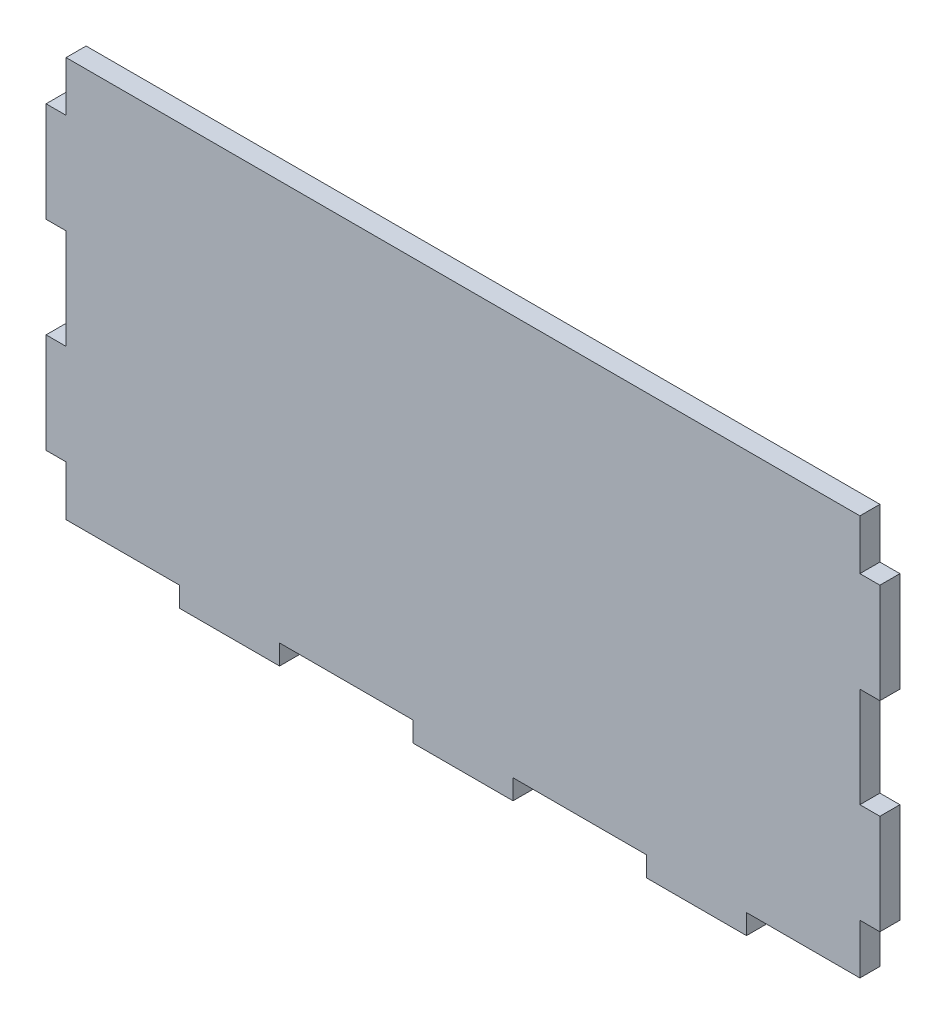
ISO-10303-21;
HEADER;
FILE_DESCRIPTION(('STEP AP214'),'2;1');
FILE_NAME('part.step','',(''),(''),'','','');
FILE_SCHEMA(('AUTOMOTIVE_DESIGN { 1 0 10303 214 1 1 1 1 }'));
ENDSEC;
DATA;
#1=APPLICATION_CONTEXT('core data for automotive mechanical design processes');
#2=APPLICATION_PROTOCOL_DEFINITION('international standard','automotive_design',2000,#1);
#3=PRODUCT_CONTEXT('',#1,'mechanical');
#4=PRODUCT('Part','Part','',(#3));
#5=PRODUCT_RELATED_PRODUCT_CATEGORY('part','',(#4));
#6=PRODUCT_DEFINITION_FORMATION('','',#4);
#7=PRODUCT_DEFINITION_CONTEXT('part definition',#1,'design');
#8=PRODUCT_DEFINITION('design','',#6,#7);
#9=PRODUCT_DEFINITION_SHAPE('','',#8);
#10=(LENGTH_UNIT() NAMED_UNIT(*) SI_UNIT(.MILLI.,.METRE.));
#11=(NAMED_UNIT(*) PLANE_ANGLE_UNIT() SI_UNIT($,.RADIAN.));
#12=(NAMED_UNIT(*) SI_UNIT($,.STERADIAN.) SOLID_ANGLE_UNIT());
#13=UNCERTAINTY_MEASURE_WITH_UNIT(LENGTH_MEASURE(1.E-05),#10,'distance_accuracy_value','');
#14=(GEOMETRIC_REPRESENTATION_CONTEXT(3) GLOBAL_UNCERTAINTY_ASSIGNED_CONTEXT((#13)) GLOBAL_UNIT_ASSIGNED_CONTEXT((#10,
#11,#12)) REPRESENTATION_CONTEXT('',''));
#15=CARTESIAN_POINT('',(0.,0.,0.));
#16=DIRECTION('',(0.,0.,1.));
#17=DIRECTION('',(1.,0.,0.));
#18=AXIS2_PLACEMENT_3D('',#15,#16,#17);
#19=CARTESIAN_POINT('',(0.,0.,6.));
#20=DIRECTION('',(-1.,0.,0.));
#21=DIRECTION('',(0.,0.,1.));
#22=AXIS2_PLACEMENT_3D('',#19,#20,#21);
#23=PLANE('',#22);
#24=DIRECTION('',(0.,1.,0.));
#25=VECTOR('',#24,1.);
#26=CARTESIAN_POINT('',(0.,0.,0.));
#27=LINE('',#26,#25);
#28=CARTESIAN_POINT('',(0.,-15.,0.));
#29=VERTEX_POINT('',#28);
#30=CARTESIAN_POINT('',(0.,0.,0.));
#31=VERTEX_POINT('',#30);
#32=EDGE_CURVE('E288',#29,#31,#27,.T.);
#33=ORIENTED_EDGE('',*,*,#32,.T.);
#34=DIRECTION('',(0.,0.,-1.));
#35=VECTOR('',#34,1.);
#36=CARTESIAN_POINT('',(0.,0.,6.));
#37=LINE('',#36,#35);
#38=CARTESIAN_POINT('',(0.,0.,6.));
#39=VERTEX_POINT('',#38);
#40=EDGE_CURVE('E11',#39,#31,#37,.T.);
#41=ORIENTED_EDGE('',*,*,#40,.F.);
#42=DIRECTION('',(0.,1.,0.));
#43=VECTOR('',#42,1.);
#44=CARTESIAN_POINT('',(0.,0.,6.));
#45=LINE('',#44,#43);
#46=CARTESIAN_POINT('',(0.,-15.,6.));
#47=VERTEX_POINT('',#46);
#48=EDGE_CURVE('E382',#47,#39,#45,.T.);
#49=ORIENTED_EDGE('',*,*,#48,.F.);
#50=DIRECTION('',(0.,0.,-1.));
#51=VECTOR('',#50,1.);
#52=CARTESIAN_POINT('',(0.,-15.,6.));
#53=LINE('',#52,#51);
#54=EDGE_CURVE('E284',#47,#29,#53,.T.);
#55=ORIENTED_EDGE('',*,*,#54,.T.);
#56=EDGE_LOOP('',(#33,#41,#49,#55));
#57=FACE_BOUND('',#56,.T.);
#58=ADVANCED_FACE('F43',(#57),#23,.F.);
#59=CARTESIAN_POINT('',(0.,0.,6.));
#60=DIRECTION('',(0.,-1.,0.));
#61=DIRECTION('',(0.,0.,-1.));
#62=AXIS2_PLACEMENT_3D('',#59,#60,#61);
#63=PLANE('',#62);
#64=DIRECTION('',(-1.,0.,0.));
#65=VECTOR('',#64,1.);
#66=CARTESIAN_POINT('',(0.,0.,0.));
#67=LINE('',#66,#65);
#68=CARTESIAN_POINT('',(-238.,0.,0.));
#69=VERTEX_POINT('',#68);
#70=EDGE_CURVE('E292',#31,#69,#67,.T.);
#71=ORIENTED_EDGE('',*,*,#70,.T.);
#72=DIRECTION('',(0.,0.,-1.));
#73=VECTOR('',#72,1.);
#74=CARTESIAN_POINT('',(-238.,0.,6.));
#75=LINE('',#74,#73);
#76=CARTESIAN_POINT('',(-238.,0.,6.));
#77=VERTEX_POINT('',#76);
#78=EDGE_CURVE('E52',#77,#69,#75,.T.);
#79=ORIENTED_EDGE('',*,*,#78,.F.);
#80=DIRECTION('',(-1.,0.,0.));
#81=VECTOR('',#80,1.);
#82=CARTESIAN_POINT('',(0.,0.,6.));
#83=LINE('',#82,#81);
#84=EDGE_CURVE('E175',#39,#77,#83,.T.);
#85=ORIENTED_EDGE('',*,*,#84,.F.);
#86=ORIENTED_EDGE('',*,*,#40,.T.);
#87=EDGE_LOOP('',(#71,#79,#85,#86));
#88=FACE_BOUND('',#87,.T.);
#89=ADVANCED_FACE('F616',(#88),#63,.F.);
#90=CARTESIAN_POINT('',(-238.,0.,6.));
#91=DIRECTION('',(1.,0.,0.));
#92=DIRECTION('',(0.,0.,-1.));
#93=AXIS2_PLACEMENT_3D('',#90,#91,#92);
#94=PLANE('',#93);
#95=DIRECTION('',(0.,-1.,0.));
#96=VECTOR('',#95,1.);
#97=CARTESIAN_POINT('',(-238.,0.,0.));
#98=LINE('',#97,#96);
#99=CARTESIAN_POINT('',(-238.,-15.,0.));
#100=VERTEX_POINT('',#99);
#101=EDGE_CURVE('E295',#69,#100,#98,.T.);
#102=ORIENTED_EDGE('',*,*,#101,.T.);
#103=DIRECTION('',(0.,0.,-1.));
#104=VECTOR('',#103,1.);
#105=CARTESIAN_POINT('',(-238.,-15.,6.));
#106=LINE('',#105,#104);
#107=CARTESIAN_POINT('',(-238.,-15.,6.));
#108=VERTEX_POINT('',#107);
#109=EDGE_CURVE('E489',#108,#100,#106,.T.);
#110=ORIENTED_EDGE('',*,*,#109,.F.);
#111=DIRECTION('',(0.,-1.,0.));
#112=VECTOR('',#111,1.);
#113=CARTESIAN_POINT('',(-238.,0.,6.));
#114=LINE('',#113,#112);
#115=EDGE_CURVE('E499',#77,#108,#114,.T.);
#116=ORIENTED_EDGE('',*,*,#115,.F.);
#117=ORIENTED_EDGE('',*,*,#78,.T.);
#118=EDGE_LOOP('',(#102,#110,#116,#117));
#119=FACE_BOUND('',#118,.T.);
#120=ADVANCED_FACE('F497',(#119),#94,.F.);
#121=CARTESIAN_POINT('',(-238.,-15.,6.));
#122=DIRECTION('',(0.,-1.,0.));
#123=DIRECTION('',(0.,0.,-1.));
#124=AXIS2_PLACEMENT_3D('',#121,#122,#123);
#125=PLANE('',#124);
#126=DIRECTION('',(-1.,0.,0.));
#127=VECTOR('',#126,1.);
#128=CARTESIAN_POINT('',(-238.,-15.,0.));
#129=LINE('',#128,#127);
#130=CARTESIAN_POINT('',(-244.,-15.,0.));
#131=VERTEX_POINT('',#130);
#132=EDGE_CURVE('E298',#100,#131,#129,.T.);
#133=ORIENTED_EDGE('',*,*,#132,.T.);
#134=DIRECTION('',(0.,0.,-1.));
#135=VECTOR('',#134,1.);
#136=CARTESIAN_POINT('',(-244.,-15.,6.));
#137=LINE('',#136,#135);
#138=CARTESIAN_POINT('',(-244.,-15.,6.));
#139=VERTEX_POINT('',#138);
#140=EDGE_CURVE('E485',#139,#131,#137,.T.);
#141=ORIENTED_EDGE('',*,*,#140,.F.);
#142=DIRECTION('',(-1.,0.,0.));
#143=VECTOR('',#142,1.);
#144=CARTESIAN_POINT('',(-238.,-15.,6.));
#145=LINE('',#144,#143);
#146=EDGE_CURVE('E518',#108,#139,#145,.T.);
#147=ORIENTED_EDGE('',*,*,#146,.F.);
#148=ORIENTED_EDGE('',*,*,#109,.T.);
#149=EDGE_LOOP('',(#133,#141,#147,#148));
#150=FACE_BOUND('',#149,.T.);
#151=ADVANCED_FACE('F508',(#150),#125,.F.);
#152=CARTESIAN_POINT('',(-244.,-45.,6.));
#153=DIRECTION('',(1.,0.,0.));
#154=DIRECTION('',(0.,0.,-1.));
#155=AXIS2_PLACEMENT_3D('',#152,#153,#154);
#156=PLANE('',#155);
#157=DIRECTION('',(0.,-1.,0.));
#158=VECTOR('',#157,1.);
#159=CARTESIAN_POINT('',(-244.,-45.,0.));
#160=LINE('',#159,#158);
#161=CARTESIAN_POINT('',(-244.,-45.,0.));
#162=VERTEX_POINT('',#161);
#163=EDGE_CURVE('E301',#131,#162,#160,.T.);
#164=ORIENTED_EDGE('',*,*,#163,.T.);
#165=DIRECTION('',(0.,0.,-1.));
#166=VECTOR('',#165,1.);
#167=CARTESIAN_POINT('',(-244.,-45.,6.));
#168=LINE('',#167,#166);
#169=CARTESIAN_POINT('',(-244.,-45.,6.));
#170=VERTEX_POINT('',#169);
#171=EDGE_CURVE('E481',#170,#162,#168,.T.);
#172=ORIENTED_EDGE('',*,*,#171,.F.);
#173=DIRECTION('',(0.,-1.,0.));
#174=VECTOR('',#173,1.);
#175=CARTESIAN_POINT('',(-244.,-45.,6.));
#176=LINE('',#175,#174);
#177=EDGE_CURVE('E514',#139,#170,#176,.T.);
#178=ORIENTED_EDGE('',*,*,#177,.F.);
#179=ORIENTED_EDGE('',*,*,#140,.T.);
#180=EDGE_LOOP('',(#164,#172,#178,#179));
#181=FACE_BOUND('',#180,.T.);
#182=ADVANCED_FACE('F512',(#181),#156,.F.);
#183=CARTESIAN_POINT('',(-238.,-45.,6.));
#184=DIRECTION('',(0.,1.,0.));
#185=DIRECTION('',(0.,0.,1.));
#186=AXIS2_PLACEMENT_3D('',#183,#184,#185);
#187=PLANE('',#186);
#188=DIRECTION('',(1.,0.,0.));
#189=VECTOR('',#188,1.);
#190=CARTESIAN_POINT('',(-238.,-45.,0.));
#191=LINE('',#190,#189);
#192=CARTESIAN_POINT('',(-238.,-45.,0.));
#193=VERTEX_POINT('',#192);
#194=EDGE_CURVE('E304',#162,#193,#191,.T.);
#195=ORIENTED_EDGE('',*,*,#194,.T.);
#196=DIRECTION('',(0.,0.,-1.));
#197=VECTOR('',#196,1.);
#198=CARTESIAN_POINT('',(-238.,-45.,6.));
#199=LINE('',#198,#197);
#200=CARTESIAN_POINT('',(-238.,-45.,6.));
#201=VERTEX_POINT('',#200);
#202=EDGE_CURVE('E477',#201,#193,#199,.T.);
#203=ORIENTED_EDGE('',*,*,#202,.F.);
#204=DIRECTION('',(1.,0.,0.));
#205=VECTOR('',#204,1.);
#206=CARTESIAN_POINT('',(-238.,-45.,6.));
#207=LINE('',#206,#205);
#208=EDGE_CURVE('E517',#170,#201,#207,.T.);
#209=ORIENTED_EDGE('',*,*,#208,.F.);
#210=ORIENTED_EDGE('',*,*,#171,.T.);
#211=EDGE_LOOP('',(#195,#203,#209,#210));
#212=FACE_BOUND('',#211,.T.);
#213=ADVANCED_FACE('F629',(#212),#187,.F.);
#214=CARTESIAN_POINT('',(-238.,-45.,6.));
#215=DIRECTION('',(1.,0.,0.));
#216=DIRECTION('',(0.,0.,-1.));
#217=AXIS2_PLACEMENT_3D('',#214,#215,#216);
#218=PLANE('',#217);
#219=DIRECTION('',(0.,-1.,0.));
#220=VECTOR('',#219,1.);
#221=CARTESIAN_POINT('',(-238.,-45.,0.));
#222=LINE('',#221,#220);
#223=CARTESIAN_POINT('',(-238.,-75.,0.));
#224=VERTEX_POINT('',#223);
#225=EDGE_CURVE('E307',#193,#224,#222,.T.);
#226=ORIENTED_EDGE('',*,*,#225,.T.);
#227=DIRECTION('',(0.,0.,-1.));
#228=VECTOR('',#227,1.);
#229=CARTESIAN_POINT('',(-238.,-75.,6.));
#230=LINE('',#229,#228);
#231=CARTESIAN_POINT('',(-238.,-75.,6.));
#232=VERTEX_POINT('',#231);
#233=EDGE_CURVE('E473',#232,#224,#230,.T.);
#234=ORIENTED_EDGE('',*,*,#233,.F.);
#235=DIRECTION('',(0.,-1.,0.));
#236=VECTOR('',#235,1.);
#237=CARTESIAN_POINT('',(-238.,-45.,6.));
#238=LINE('',#237,#236);
#239=EDGE_CURVE('E522',#201,#232,#238,.T.);
#240=ORIENTED_EDGE('',*,*,#239,.F.);
#241=ORIENTED_EDGE('',*,*,#202,.T.);
#242=EDGE_LOOP('',(#226,#234,#240,#241));
#243=FACE_BOUND('',#242,.T.);
#244=ADVANCED_FACE('F632',(#243),#218,.F.);
#245=CARTESIAN_POINT('',(-238.,-75.,6.));
#246=DIRECTION('',(0.,-1.,0.));
#247=DIRECTION('',(1.,0.,0.));
#248=AXIS2_PLACEMENT_3D('',#245,#246,#247);
#249=PLANE('',#248);
#250=DIRECTION('',(-1.,0.,0.));
#251=VECTOR('',#250,1.);
#252=CARTESIAN_POINT('',(-238.,-75.,0.));
#253=LINE('',#252,#251);
#254=CARTESIAN_POINT('',(-244.,-75.,0.));
#255=VERTEX_POINT('',#254);
#256=EDGE_CURVE('E310',#224,#255,#253,.T.);
#257=ORIENTED_EDGE('',*,*,#256,.T.);
#258=DIRECTION('',(0.,0.,-1.));
#259=VECTOR('',#258,1.);
#260=CARTESIAN_POINT('',(-244.,-75.,6.));
#261=LINE('',#260,#259);
#262=CARTESIAN_POINT('',(-244.,-75.,6.));
#263=VERTEX_POINT('',#262);
#264=EDGE_CURVE('E469',#263,#255,#261,.T.);
#265=ORIENTED_EDGE('',*,*,#264,.F.);
#266=DIRECTION('',(-1.,0.,0.));
#267=VECTOR('',#266,1.);
#268=CARTESIAN_POINT('',(-238.,-75.,6.));
#269=LINE('',#268,#267);
#270=EDGE_CURVE('E529',#232,#263,#269,.T.);
#271=ORIENTED_EDGE('',*,*,#270,.F.);
#272=ORIENTED_EDGE('',*,*,#233,.T.);
#273=EDGE_LOOP('',(#257,#265,#271,#272));
#274=FACE_BOUND('',#273,.T.);
#275=ADVANCED_FACE('F636',(#274),#249,.F.);
#276=CARTESIAN_POINT('',(-244.,-105.,6.));
#277=DIRECTION('',(1.,0.,0.));
#278=DIRECTION('',(0.,0.,-1.));
#279=AXIS2_PLACEMENT_3D('',#276,#277,#278);
#280=PLANE('',#279);
#281=DIRECTION('',(0.,-1.,0.));
#282=VECTOR('',#281,1.);
#283=CARTESIAN_POINT('',(-244.,-105.,0.));
#284=LINE('',#283,#282);
#285=CARTESIAN_POINT('',(-244.,-105.,0.));
#286=VERTEX_POINT('',#285);
#287=EDGE_CURVE('E313',#255,#286,#284,.T.);
#288=ORIENTED_EDGE('',*,*,#287,.T.);
#289=DIRECTION('',(0.,0.,-1.));
#290=VECTOR('',#289,1.);
#291=CARTESIAN_POINT('',(-244.,-105.,6.));
#292=LINE('',#291,#290);
#293=CARTESIAN_POINT('',(-244.,-105.,6.));
#294=VERTEX_POINT('',#293);
#295=EDGE_CURVE('E465',#294,#286,#292,.T.);
#296=ORIENTED_EDGE('',*,*,#295,.F.);
#297=DIRECTION('',(0.,-1.,0.));
#298=VECTOR('',#297,1.);
#299=CARTESIAN_POINT('',(-244.,-105.,6.));
#300=LINE('',#299,#298);
#301=EDGE_CURVE('E532',#263,#294,#300,.T.);
#302=ORIENTED_EDGE('',*,*,#301,.F.);
#303=ORIENTED_EDGE('',*,*,#264,.T.);
#304=EDGE_LOOP('',(#288,#296,#302,#303));
#305=FACE_BOUND('',#304,.T.);
#306=ADVANCED_FACE('F640',(#305),#280,.F.);
#307=CARTESIAN_POINT('',(-238.,-105.,6.));
#308=DIRECTION('',(0.,1.,0.));
#309=DIRECTION('',(0.,0.,1.));
#310=AXIS2_PLACEMENT_3D('',#307,#308,#309);
#311=PLANE('',#310);
#312=DIRECTION('',(1.,0.,0.));
#313=VECTOR('',#312,1.);
#314=CARTESIAN_POINT('',(-238.,-105.,0.));
#315=LINE('',#314,#313);
#316=CARTESIAN_POINT('',(-238.,-105.,0.));
#317=VERTEX_POINT('',#316);
#318=EDGE_CURVE('E316',#286,#317,#315,.T.);
#319=ORIENTED_EDGE('',*,*,#318,.T.);
#320=DIRECTION('',(0.,0.,-1.));
#321=VECTOR('',#320,1.);
#322=CARTESIAN_POINT('',(-238.,-105.,6.));
#323=LINE('',#322,#321);
#324=CARTESIAN_POINT('',(-238.,-105.,6.));
#325=VERTEX_POINT('',#324);
#326=EDGE_CURVE('E461',#325,#317,#323,.T.);
#327=ORIENTED_EDGE('',*,*,#326,.F.);
#328=DIRECTION('',(1.,0.,0.));
#329=VECTOR('',#328,1.);
#330=CARTESIAN_POINT('',(-238.,-105.,6.));
#331=LINE('',#330,#329);
#332=EDGE_CURVE('E535',#294,#325,#331,.T.);
#333=ORIENTED_EDGE('',*,*,#332,.F.);
#334=ORIENTED_EDGE('',*,*,#295,.T.);
#335=EDGE_LOOP('',(#319,#327,#333,#334));
#336=FACE_BOUND('',#335,.T.);
#337=ADVANCED_FACE('F644',(#336),#311,.F.);
#338=CARTESIAN_POINT('',(-238.,-105.,6.));
#339=DIRECTION('',(1.,0.,0.));
#340=DIRECTION('',(0.,1.,0.));
#341=AXIS2_PLACEMENT_3D('',#338,#339,#340);
#342=PLANE('',#341);
#343=DIRECTION('',(0.,-1.,0.));
#344=VECTOR('',#343,1.);
#345=CARTESIAN_POINT('',(-238.,-105.,0.));
#346=LINE('',#345,#344);
#347=CARTESIAN_POINT('',(-238.,-120.,0.));
#348=VERTEX_POINT('',#347);
#349=EDGE_CURVE('E319',#317,#348,#346,.T.);
#350=ORIENTED_EDGE('',*,*,#349,.T.);
#351=DIRECTION('',(0.,0.,-1.));
#352=VECTOR('',#351,1.);
#353=CARTESIAN_POINT('',(-238.,-120.,6.));
#354=LINE('',#353,#352);
#355=CARTESIAN_POINT('',(-238.,-120.,6.));
#356=VERTEX_POINT('',#355);
#357=EDGE_CURVE('E457',#356,#348,#354,.T.);
#358=ORIENTED_EDGE('',*,*,#357,.F.);
#359=DIRECTION('',(0.,-1.,0.));
#360=VECTOR('',#359,1.);
#361=CARTESIAN_POINT('',(-238.,-105.,6.));
#362=LINE('',#361,#360);
#363=EDGE_CURVE('E538',#325,#356,#362,.T.);
#364=ORIENTED_EDGE('',*,*,#363,.F.);
#365=ORIENTED_EDGE('',*,*,#326,.T.);
#366=EDGE_LOOP('',(#350,#358,#364,#365));
#367=FACE_BOUND('',#366,.T.);
#368=ADVANCED_FACE('F648',(#367),#342,.F.);
#369=CARTESIAN_POINT('',(-204.,-120.,6.));
#370=DIRECTION('',(0.,1.,0.));
#371=DIRECTION('',(-1.,0.,0.));
#372=AXIS2_PLACEMENT_3D('',#369,#370,#371);
#373=PLANE('',#372);
#374=DIRECTION('',(1.,0.,0.));
#375=VECTOR('',#374,1.);
#376=CARTESIAN_POINT('',(-204.,-120.,0.));
#377=LINE('',#376,#375);
#378=CARTESIAN_POINT('',(-204.,-120.,0.));
#379=VERTEX_POINT('',#378);
#380=EDGE_CURVE('E322',#348,#379,#377,.T.);
#381=ORIENTED_EDGE('',*,*,#380,.T.);
#382=DIRECTION('',(0.,0.,-1.));
#383=VECTOR('',#382,1.);
#384=CARTESIAN_POINT('',(-204.,-120.,6.));
#385=LINE('',#384,#383);
#386=CARTESIAN_POINT('',(-204.,-120.,6.));
#387=VERTEX_POINT('',#386);
#388=EDGE_CURVE('E453',#387,#379,#385,.T.);
#389=ORIENTED_EDGE('',*,*,#388,.F.);
#390=DIRECTION('',(1.,0.,0.));
#391=VECTOR('',#390,1.);
#392=CARTESIAN_POINT('',(-204.,-120.,6.));
#393=LINE('',#392,#391);
#394=EDGE_CURVE('E541',#356,#387,#393,.T.);
#395=ORIENTED_EDGE('',*,*,#394,.F.);
#396=ORIENTED_EDGE('',*,*,#357,.T.);
#397=EDGE_LOOP('',(#381,#389,#395,#396));
#398=FACE_BOUND('',#397,.T.);
#399=ADVANCED_FACE('F652',(#398),#373,.F.);
#400=CARTESIAN_POINT('',(-204.,-120.,6.));
#401=DIRECTION('',(1.,0.,0.));
#402=DIRECTION('',(0.,0.,-1.));
#403=AXIS2_PLACEMENT_3D('',#400,#401,#402);
#404=PLANE('',#403);
#405=DIRECTION('',(0.,-1.,0.));
#406=VECTOR('',#405,1.);
#407=CARTESIAN_POINT('',(-204.,-120.,0.));
#408=LINE('',#407,#406);
#409=CARTESIAN_POINT('',(-204.,-126.,0.));
#410=VERTEX_POINT('',#409);
#411=EDGE_CURVE('E325',#379,#410,#408,.T.);
#412=ORIENTED_EDGE('',*,*,#411,.T.);
#413=DIRECTION('',(0.,0.,-1.));
#414=VECTOR('',#413,1.);
#415=CARTESIAN_POINT('',(-204.,-126.,6.));
#416=LINE('',#415,#414);
#417=CARTESIAN_POINT('',(-204.,-126.,6.));
#418=VERTEX_POINT('',#417);
#419=EDGE_CURVE('E449',#418,#410,#416,.T.);
#420=ORIENTED_EDGE('',*,*,#419,.F.);
#421=DIRECTION('',(0.,-1.,0.));
#422=VECTOR('',#421,1.);
#423=CARTESIAN_POINT('',(-204.,-120.,6.));
#424=LINE('',#423,#422);
#425=EDGE_CURVE('E544',#387,#418,#424,.T.);
#426=ORIENTED_EDGE('',*,*,#425,.F.);
#427=ORIENTED_EDGE('',*,*,#388,.T.);
#428=EDGE_LOOP('',(#412,#420,#426,#427));
#429=FACE_BOUND('',#428,.T.);
#430=ADVANCED_FACE('F656',(#429),#404,.F.);
#431=CARTESIAN_POINT('',(-204.,-126.,6.));
#432=DIRECTION('',(0.,1.,0.));
#433=DIRECTION('',(0.,0.,1.));
#434=AXIS2_PLACEMENT_3D('',#431,#432,#433);
#435=PLANE('',#434);
#436=DIRECTION('',(1.,0.,0.));
#437=VECTOR('',#436,1.);
#438=CARTESIAN_POINT('',(-204.,-126.,0.));
#439=LINE('',#438,#437);
#440=CARTESIAN_POINT('',(-174.,-126.,0.));
#441=VERTEX_POINT('',#440);
#442=EDGE_CURVE('E328',#410,#441,#439,.T.);
#443=ORIENTED_EDGE('',*,*,#442,.T.);
#444=DIRECTION('',(0.,0.,-1.));
#445=VECTOR('',#444,1.);
#446=CARTESIAN_POINT('',(-174.,-126.,6.));
#447=LINE('',#446,#445);
#448=CARTESIAN_POINT('',(-174.,-126.,6.));
#449=VERTEX_POINT('',#448);
#450=EDGE_CURVE('E445',#449,#441,#447,.T.);
#451=ORIENTED_EDGE('',*,*,#450,.F.);
#452=DIRECTION('',(1.,0.,0.));
#453=VECTOR('',#452,1.);
#454=CARTESIAN_POINT('',(-204.,-126.,6.));
#455=LINE('',#454,#453);
#456=EDGE_CURVE('E547',#418,#449,#455,.T.);
#457=ORIENTED_EDGE('',*,*,#456,.F.);
#458=ORIENTED_EDGE('',*,*,#419,.T.);
#459=EDGE_LOOP('',(#443,#451,#457,#458));
#460=FACE_BOUND('',#459,.T.);
#461=ADVANCED_FACE('F660',(#460),#435,.F.);
#462=CARTESIAN_POINT('',(-174.,-120.,6.));
#463=DIRECTION('',(-1.,0.,0.));
#464=DIRECTION('',(0.,0.,1.));
#465=AXIS2_PLACEMENT_3D('',#462,#463,#464);
#466=PLANE('',#465);
#467=DIRECTION('',(0.,1.,0.));
#468=VECTOR('',#467,1.);
#469=CARTESIAN_POINT('',(-174.,-120.,0.));
#470=LINE('',#469,#468);
#471=CARTESIAN_POINT('',(-174.,-120.,0.));
#472=VERTEX_POINT('',#471);
#473=EDGE_CURVE('E331',#441,#472,#470,.T.);
#474=ORIENTED_EDGE('',*,*,#473,.T.);
#475=DIRECTION('',(0.,0.,-1.));
#476=VECTOR('',#475,1.);
#477=CARTESIAN_POINT('',(-174.,-120.,6.));
#478=LINE('',#477,#476);
#479=CARTESIAN_POINT('',(-174.,-120.,6.));
#480=VERTEX_POINT('',#479);
#481=EDGE_CURVE('E441',#480,#472,#478,.T.);
#482=ORIENTED_EDGE('',*,*,#481,.F.);
#483=DIRECTION('',(0.,1.,0.));
#484=VECTOR('',#483,1.);
#485=CARTESIAN_POINT('',(-174.,-120.,6.));
#486=LINE('',#485,#484);
#487=EDGE_CURVE('E550',#449,#480,#486,.T.);
#488=ORIENTED_EDGE('',*,*,#487,.F.);
#489=ORIENTED_EDGE('',*,*,#450,.T.);
#490=EDGE_LOOP('',(#474,#482,#488,#489));
#491=FACE_BOUND('',#490,.T.);
#492=ADVANCED_FACE('F664',(#491),#466,.F.);
#493=CARTESIAN_POINT('',(-134.,-120.,6.));
#494=DIRECTION('',(0.,1.,0.));
#495=DIRECTION('',(-1.,0.,0.));
#496=AXIS2_PLACEMENT_3D('',#493,#494,#495);
#497=PLANE('',#496);
#498=DIRECTION('',(1.,0.,0.));
#499=VECTOR('',#498,1.);
#500=CARTESIAN_POINT('',(-134.,-120.,0.));
#501=LINE('',#500,#499);
#502=CARTESIAN_POINT('',(-134.,-120.,0.));
#503=VERTEX_POINT('',#502);
#504=EDGE_CURVE('E334',#472,#503,#501,.T.);
#505=ORIENTED_EDGE('',*,*,#504,.T.);
#506=DIRECTION('',(0.,0.,-1.));
#507=VECTOR('',#506,1.);
#508=CARTESIAN_POINT('',(-134.,-120.,6.));
#509=LINE('',#508,#507);
#510=CARTESIAN_POINT('',(-134.,-120.,6.));
#511=VERTEX_POINT('',#510);
#512=EDGE_CURVE('E437',#511,#503,#509,.T.);
#513=ORIENTED_EDGE('',*,*,#512,.F.);
#514=DIRECTION('',(1.,0.,0.));
#515=VECTOR('',#514,1.);
#516=CARTESIAN_POINT('',(-134.,-120.,6.));
#517=LINE('',#516,#515);
#518=EDGE_CURVE('E553',#480,#511,#517,.T.);
#519=ORIENTED_EDGE('',*,*,#518,.F.);
#520=ORIENTED_EDGE('',*,*,#481,.T.);
#521=EDGE_LOOP('',(#505,#513,#519,#520));
#522=FACE_BOUND('',#521,.T.);
#523=ADVANCED_FACE('F668',(#522),#497,.F.);
#524=CARTESIAN_POINT('',(-134.,-120.,6.));
#525=DIRECTION('',(1.,0.,0.));
#526=DIRECTION('',(0.,0.,-1.));
#527=AXIS2_PLACEMENT_3D('',#524,#525,#526);
#528=PLANE('',#527);
#529=DIRECTION('',(0.,-1.,0.));
#530=VECTOR('',#529,1.);
#531=CARTESIAN_POINT('',(-134.,-120.,0.));
#532=LINE('',#531,#530);
#533=CARTESIAN_POINT('',(-134.,-126.,0.));
#534=VERTEX_POINT('',#533);
#535=EDGE_CURVE('E337',#503,#534,#532,.T.);
#536=ORIENTED_EDGE('',*,*,#535,.T.);
#537=DIRECTION('',(0.,0.,-1.));
#538=VECTOR('',#537,1.);
#539=CARTESIAN_POINT('',(-134.,-126.,6.));
#540=LINE('',#539,#538);
#541=CARTESIAN_POINT('',(-134.,-126.,6.));
#542=VERTEX_POINT('',#541);
#543=EDGE_CURVE('E433',#542,#534,#540,.T.);
#544=ORIENTED_EDGE('',*,*,#543,.F.);
#545=DIRECTION('',(0.,-1.,0.));
#546=VECTOR('',#545,1.);
#547=CARTESIAN_POINT('',(-134.,-120.,6.));
#548=LINE('',#547,#546);
#549=EDGE_CURVE('E556',#511,#542,#548,.T.);
#550=ORIENTED_EDGE('',*,*,#549,.F.);
#551=ORIENTED_EDGE('',*,*,#512,.T.);
#552=EDGE_LOOP('',(#536,#544,#550,#551));
#553=FACE_BOUND('',#552,.T.);
#554=ADVANCED_FACE('F672',(#553),#528,.F.);
#555=CARTESIAN_POINT('',(-134.,-126.,6.));
#556=DIRECTION('',(0.,1.,0.));
#557=DIRECTION('',(0.,0.,1.));
#558=AXIS2_PLACEMENT_3D('',#555,#556,#557);
#559=PLANE('',#558);
#560=DIRECTION('',(1.,0.,0.));
#561=VECTOR('',#560,1.);
#562=CARTESIAN_POINT('',(-134.,-126.,0.));
#563=LINE('',#562,#561);
#564=CARTESIAN_POINT('',(-104.,-126.,0.));
#565=VERTEX_POINT('',#564);
#566=EDGE_CURVE('E340',#534,#565,#563,.T.);
#567=ORIENTED_EDGE('',*,*,#566,.T.);
#568=DIRECTION('',(0.,0.,-1.));
#569=VECTOR('',#568,1.);
#570=CARTESIAN_POINT('',(-104.,-126.,6.));
#571=LINE('',#570,#569);
#572=CARTESIAN_POINT('',(-104.,-126.,6.));
#573=VERTEX_POINT('',#572);
#574=EDGE_CURVE('E429',#573,#565,#571,.T.);
#575=ORIENTED_EDGE('',*,*,#574,.F.);
#576=DIRECTION('',(1.,0.,0.));
#577=VECTOR('',#576,1.);
#578=CARTESIAN_POINT('',(-134.,-126.,6.));
#579=LINE('',#578,#577);
#580=EDGE_CURVE('E559',#542,#573,#579,.T.);
#581=ORIENTED_EDGE('',*,*,#580,.F.);
#582=ORIENTED_EDGE('',*,*,#543,.T.);
#583=EDGE_LOOP('',(#567,#575,#581,#582));
#584=FACE_BOUND('',#583,.T.);
#585=ADVANCED_FACE('F676',(#584),#559,.F.);
#586=CARTESIAN_POINT('',(-104.,-120.,6.));
#587=DIRECTION('',(-1.,0.,0.));
#588=DIRECTION('',(0.,0.,1.));
#589=AXIS2_PLACEMENT_3D('',#586,#587,#588);
#590=PLANE('',#589);
#591=DIRECTION('',(0.,1.,0.));
#592=VECTOR('',#591,1.);
#593=CARTESIAN_POINT('',(-104.,-120.,0.));
#594=LINE('',#593,#592);
#595=CARTESIAN_POINT('',(-104.,-120.,0.));
#596=VERTEX_POINT('',#595);
#597=EDGE_CURVE('E343',#565,#596,#594,.T.);
#598=ORIENTED_EDGE('',*,*,#597,.T.);
#599=DIRECTION('',(0.,0.,-1.));
#600=VECTOR('',#599,1.);
#601=CARTESIAN_POINT('',(-104.,-120.,6.));
#602=LINE('',#601,#600);
#603=CARTESIAN_POINT('',(-104.,-120.,6.));
#604=VERTEX_POINT('',#603);
#605=EDGE_CURVE('E425',#604,#596,#602,.T.);
#606=ORIENTED_EDGE('',*,*,#605,.F.);
#607=DIRECTION('',(0.,1.,0.));
#608=VECTOR('',#607,1.);
#609=CARTESIAN_POINT('',(-104.,-120.,6.));
#610=LINE('',#609,#608);
#611=EDGE_CURVE('E562',#573,#604,#610,.T.);
#612=ORIENTED_EDGE('',*,*,#611,.F.);
#613=ORIENTED_EDGE('',*,*,#574,.T.);
#614=EDGE_LOOP('',(#598,#606,#612,#613));
#615=FACE_BOUND('',#614,.T.);
#616=ADVANCED_FACE('F680',(#615),#590,.F.);
#617=CARTESIAN_POINT('',(-64.,-120.,6.));
#618=DIRECTION('',(0.,1.,0.));
#619=DIRECTION('',(-1.,0.,0.));
#620=AXIS2_PLACEMENT_3D('',#617,#618,#619);
#621=PLANE('',#620);
#622=DIRECTION('',(1.,0.,0.));
#623=VECTOR('',#622,1.);
#624=CARTESIAN_POINT('',(-64.,-120.,0.));
#625=LINE('',#624,#623);
#626=CARTESIAN_POINT('',(-64.,-120.,0.));
#627=VERTEX_POINT('',#626);
#628=EDGE_CURVE('E346',#596,#627,#625,.T.);
#629=ORIENTED_EDGE('',*,*,#628,.T.);
#630=DIRECTION('',(0.,0.,-1.));
#631=VECTOR('',#630,1.);
#632=CARTESIAN_POINT('',(-64.,-120.,6.));
#633=LINE('',#632,#631);
#634=CARTESIAN_POINT('',(-64.,-120.,6.));
#635=VERTEX_POINT('',#634);
#636=EDGE_CURVE('E421',#635,#627,#633,.T.);
#637=ORIENTED_EDGE('',*,*,#636,.F.);
#638=DIRECTION('',(1.,0.,0.));
#639=VECTOR('',#638,1.);
#640=CARTESIAN_POINT('',(-64.,-120.,6.));
#641=LINE('',#640,#639);
#642=EDGE_CURVE('E565',#604,#635,#641,.T.);
#643=ORIENTED_EDGE('',*,*,#642,.F.);
#644=ORIENTED_EDGE('',*,*,#605,.T.);
#645=EDGE_LOOP('',(#629,#637,#643,#644));
#646=FACE_BOUND('',#645,.T.);
#647=ADVANCED_FACE('F684',(#646),#621,.F.);
#648=CARTESIAN_POINT('',(-64.,-120.,6.));
#649=DIRECTION('',(1.,0.,0.));
#650=DIRECTION('',(0.,0.,-1.));
#651=AXIS2_PLACEMENT_3D('',#648,#649,#650);
#652=PLANE('',#651);
#653=DIRECTION('',(0.,-1.,0.));
#654=VECTOR('',#653,1.);
#655=CARTESIAN_POINT('',(-64.,-120.,0.));
#656=LINE('',#655,#654);
#657=CARTESIAN_POINT('',(-64.,-126.,0.));
#658=VERTEX_POINT('',#657);
#659=EDGE_CURVE('E349',#627,#658,#656,.T.);
#660=ORIENTED_EDGE('',*,*,#659,.T.);
#661=DIRECTION('',(0.,0.,-1.));
#662=VECTOR('',#661,1.);
#663=CARTESIAN_POINT('',(-64.,-126.,6.));
#664=LINE('',#663,#662);
#665=CARTESIAN_POINT('',(-64.,-126.,6.));
#666=VERTEX_POINT('',#665);
#667=EDGE_CURVE('E417',#666,#658,#664,.T.);
#668=ORIENTED_EDGE('',*,*,#667,.F.);
#669=DIRECTION('',(0.,-1.,0.));
#670=VECTOR('',#669,1.);
#671=CARTESIAN_POINT('',(-64.,-120.,6.));
#672=LINE('',#671,#670);
#673=EDGE_CURVE('E568',#635,#666,#672,.T.);
#674=ORIENTED_EDGE('',*,*,#673,.F.);
#675=ORIENTED_EDGE('',*,*,#636,.T.);
#676=EDGE_LOOP('',(#660,#668,#674,#675));
#677=FACE_BOUND('',#676,.T.);
#678=ADVANCED_FACE('F688',(#677),#652,.F.);
#679=CARTESIAN_POINT('',(-34.,-126.,6.));
#680=DIRECTION('',(0.,1.,0.));
#681=DIRECTION('',(0.,0.,1.));
#682=AXIS2_PLACEMENT_3D('',#679,#680,#681);
#683=PLANE('',#682);
#684=DIRECTION('',(1.,0.,0.));
#685=VECTOR('',#684,1.);
#686=CARTESIAN_POINT('',(-34.,-126.,0.));
#687=LINE('',#686,#685);
#688=CARTESIAN_POINT('',(-34.,-126.,0.));
#689=VERTEX_POINT('',#688);
#690=EDGE_CURVE('E352',#658,#689,#687,.T.);
#691=ORIENTED_EDGE('',*,*,#690,.T.);
#692=DIRECTION('',(0.,0.,-1.));
#693=VECTOR('',#692,1.);
#694=CARTESIAN_POINT('',(-34.,-126.,6.));
#695=LINE('',#694,#693);
#696=CARTESIAN_POINT('',(-34.,-126.,6.));
#697=VERTEX_POINT('',#696);
#698=EDGE_CURVE('E413',#697,#689,#695,.T.);
#699=ORIENTED_EDGE('',*,*,#698,.F.);
#700=DIRECTION('',(1.,0.,0.));
#701=VECTOR('',#700,1.);
#702=CARTESIAN_POINT('',(-34.,-126.,6.));
#703=LINE('',#702,#701);
#704=EDGE_CURVE('E571',#666,#697,#703,.T.);
#705=ORIENTED_EDGE('',*,*,#704,.F.);
#706=ORIENTED_EDGE('',*,*,#667,.T.);
#707=EDGE_LOOP('',(#691,#699,#705,#706));
#708=FACE_BOUND('',#707,.T.);
#709=ADVANCED_FACE('F692',(#708),#683,.F.);
#710=CARTESIAN_POINT('',(-34.,-120.,6.));
#711=DIRECTION('',(-1.,0.,0.));
#712=DIRECTION('',(0.,0.,1.));
#713=AXIS2_PLACEMENT_3D('',#710,#711,#712);
#714=PLANE('',#713);
#715=DIRECTION('',(0.,1.,0.));
#716=VECTOR('',#715,1.);
#717=CARTESIAN_POINT('',(-34.,-120.,0.));
#718=LINE('',#717,#716);
#719=CARTESIAN_POINT('',(-34.,-120.,0.));
#720=VERTEX_POINT('',#719);
#721=EDGE_CURVE('E355',#689,#720,#718,.T.);
#722=ORIENTED_EDGE('',*,*,#721,.T.);
#723=DIRECTION('',(0.,0.,-1.));
#724=VECTOR('',#723,1.);
#725=CARTESIAN_POINT('',(-34.,-120.,6.));
#726=LINE('',#725,#724);
#727=CARTESIAN_POINT('',(-34.,-120.,6.));
#728=VERTEX_POINT('',#727);
#729=EDGE_CURVE('E409',#728,#720,#726,.T.);
#730=ORIENTED_EDGE('',*,*,#729,.F.);
#731=DIRECTION('',(0.,1.,0.));
#732=VECTOR('',#731,1.);
#733=CARTESIAN_POINT('',(-34.,-120.,6.));
#734=LINE('',#733,#732);
#735=EDGE_CURVE('E574',#697,#728,#734,.T.);
#736=ORIENTED_EDGE('',*,*,#735,.F.);
#737=ORIENTED_EDGE('',*,*,#698,.T.);
#738=EDGE_LOOP('',(#722,#730,#736,#737));
#739=FACE_BOUND('',#738,.T.);
#740=ADVANCED_FACE('F696',(#739),#714,.F.);
#741=CARTESIAN_POINT('',(0.,-120.,6.));
#742=DIRECTION('',(0.,1.,0.));
#743=DIRECTION('',(-1.,0.,0.));
#744=AXIS2_PLACEMENT_3D('',#741,#742,#743);
#745=PLANE('',#744);
#746=DIRECTION('',(1.,0.,0.));
#747=VECTOR('',#746,1.);
#748=CARTESIAN_POINT('',(0.,-120.,0.));
#749=LINE('',#748,#747);
#750=CARTESIAN_POINT('',(0.,-120.,0.));
#751=VERTEX_POINT('',#750);
#752=EDGE_CURVE('E358',#720,#751,#749,.T.);
#753=ORIENTED_EDGE('',*,*,#752,.T.);
#754=DIRECTION('',(0.,0.,-1.));
#755=VECTOR('',#754,1.);
#756=CARTESIAN_POINT('',(0.,-120.,6.));
#757=LINE('',#756,#755);
#758=CARTESIAN_POINT('',(0.,-120.,6.));
#759=VERTEX_POINT('',#758);
#760=EDGE_CURVE('E405',#759,#751,#757,.T.);
#761=ORIENTED_EDGE('',*,*,#760,.F.);
#762=DIRECTION('',(1.,0.,0.));
#763=VECTOR('',#762,1.);
#764=CARTESIAN_POINT('',(0.,-120.,6.));
#765=LINE('',#764,#763);
#766=EDGE_CURVE('E577',#728,#759,#765,.T.);
#767=ORIENTED_EDGE('',*,*,#766,.F.);
#768=ORIENTED_EDGE('',*,*,#729,.T.);
#769=EDGE_LOOP('',(#753,#761,#767,#768));
#770=FACE_BOUND('',#769,.T.);
#771=ADVANCED_FACE('F700',(#770),#745,.F.);
#772=CARTESIAN_POINT('',(0.,-105.,6.));
#773=DIRECTION('',(-1.,0.,0.));
#774=DIRECTION('',(0.,-1.,0.));
#775=AXIS2_PLACEMENT_3D('',#772,#773,#774);
#776=PLANE('',#775);
#777=DIRECTION('',(0.,1.,0.));
#778=VECTOR('',#777,1.);
#779=CARTESIAN_POINT('',(0.,-105.,0.));
#780=LINE('',#779,#778);
#781=CARTESIAN_POINT('',(0.,-105.,0.));
#782=VERTEX_POINT('',#781);
#783=EDGE_CURVE('E361',#751,#782,#780,.T.);
#784=ORIENTED_EDGE('',*,*,#783,.T.);
#785=DIRECTION('',(0.,0.,-1.));
#786=VECTOR('',#785,1.);
#787=CARTESIAN_POINT('',(0.,-105.,6.));
#788=LINE('',#787,#786);
#789=CARTESIAN_POINT('',(0.,-105.,6.));
#790=VERTEX_POINT('',#789);
#791=EDGE_CURVE('E401',#790,#782,#788,.T.);
#792=ORIENTED_EDGE('',*,*,#791,.F.);
#793=DIRECTION('',(0.,1.,0.));
#794=VECTOR('',#793,1.);
#795=CARTESIAN_POINT('',(0.,-105.,6.));
#796=LINE('',#795,#794);
#797=EDGE_CURVE('E580',#759,#790,#796,.T.);
#798=ORIENTED_EDGE('',*,*,#797,.F.);
#799=ORIENTED_EDGE('',*,*,#760,.T.);
#800=EDGE_LOOP('',(#784,#792,#798,#799));
#801=FACE_BOUND('',#800,.T.);
#802=ADVANCED_FACE('F704',(#801),#776,.F.);
#803=CARTESIAN_POINT('',(0.,-105.,6.));
#804=DIRECTION('',(0.,1.,0.));
#805=DIRECTION('',(0.,0.,1.));
#806=AXIS2_PLACEMENT_3D('',#803,#804,#805);
#807=PLANE('',#806);
#808=DIRECTION('',(1.,0.,0.));
#809=VECTOR('',#808,1.);
#810=CARTESIAN_POINT('',(0.,-105.,0.));
#811=LINE('',#810,#809);
#812=CARTESIAN_POINT('',(6.00000000000001,-105.,0.));
#813=VERTEX_POINT('',#812);
#814=EDGE_CURVE('E364',#782,#813,#811,.T.);
#815=ORIENTED_EDGE('',*,*,#814,.T.);
#816=DIRECTION('',(0.,0.,-1.));
#817=VECTOR('',#816,1.);
#818=CARTESIAN_POINT('',(6.00000000000001,-105.,6.));
#819=LINE('',#818,#817);
#820=CARTESIAN_POINT('',(6.00000000000001,-105.,6.));
#821=VERTEX_POINT('',#820);
#822=EDGE_CURVE('E397',#821,#813,#819,.T.);
#823=ORIENTED_EDGE('',*,*,#822,.F.);
#824=DIRECTION('',(1.,0.,0.));
#825=VECTOR('',#824,1.);
#826=CARTESIAN_POINT('',(0.,-105.,6.));
#827=LINE('',#826,#825);
#828=EDGE_CURVE('E583',#790,#821,#827,.T.);
#829=ORIENTED_EDGE('',*,*,#828,.F.);
#830=ORIENTED_EDGE('',*,*,#791,.T.);
#831=EDGE_LOOP('',(#815,#823,#829,#830));
#832=FACE_BOUND('',#831,.T.);
#833=ADVANCED_FACE('F708',(#832),#807,.F.);
#834=CARTESIAN_POINT('',(6.00000000000001,-105.,6.));
#835=DIRECTION('',(-1.,0.,0.));
#836=DIRECTION('',(0.,0.,1.));
#837=AXIS2_PLACEMENT_3D('',#834,#835,#836);
#838=PLANE('',#837);
#839=DIRECTION('',(0.,1.,0.));
#840=VECTOR('',#839,1.);
#841=CARTESIAN_POINT('',(6.00000000000001,-105.,0.));
#842=LINE('',#841,#840);
#843=CARTESIAN_POINT('',(6.00000000000001,-75.,0.));
#844=VERTEX_POINT('',#843);
#845=EDGE_CURVE('E367',#813,#844,#842,.T.);
#846=ORIENTED_EDGE('',*,*,#845,.T.);
#847=DIRECTION('',(0.,0.,-1.));
#848=VECTOR('',#847,1.);
#849=CARTESIAN_POINT('',(6.00000000000001,-75.,6.));
#850=LINE('',#849,#848);
#851=CARTESIAN_POINT('',(6.00000000000001,-75.,6.));
#852=VERTEX_POINT('',#851);
#853=EDGE_CURVE('E393',#852,#844,#850,.T.);
#854=ORIENTED_EDGE('',*,*,#853,.F.);
#855=DIRECTION('',(0.,1.,0.));
#856=VECTOR('',#855,1.);
#857=CARTESIAN_POINT('',(6.00000000000001,-105.,6.));
#858=LINE('',#857,#856);
#859=EDGE_CURVE('E586',#821,#852,#858,.T.);
#860=ORIENTED_EDGE('',*,*,#859,.F.);
#861=ORIENTED_EDGE('',*,*,#822,.T.);
#862=EDGE_LOOP('',(#846,#854,#860,#861));
#863=FACE_BOUND('',#862,.T.);
#864=ADVANCED_FACE('F712',(#863),#838,.F.);
#865=CARTESIAN_POINT('',(0.,-75.,6.));
#866=DIRECTION('',(0.,-1.,0.));
#867=DIRECTION('',(1.,0.,0.));
#868=AXIS2_PLACEMENT_3D('',#865,#866,#867);
#869=PLANE('',#868);
#870=DIRECTION('',(-1.,0.,0.));
#871=VECTOR('',#870,1.);
#872=CARTESIAN_POINT('',(0.,-75.,0.));
#873=LINE('',#872,#871);
#874=CARTESIAN_POINT('',(0.,-75.,0.));
#875=VERTEX_POINT('',#874);
#876=EDGE_CURVE('E370',#844,#875,#873,.T.);
#877=ORIENTED_EDGE('',*,*,#876,.T.);
#878=DIRECTION('',(0.,0.,-1.));
#879=VECTOR('',#878,1.);
#880=CARTESIAN_POINT('',(0.,-75.,6.));
#881=LINE('',#880,#879);
#882=CARTESIAN_POINT('',(0.,-75.,6.));
#883=VERTEX_POINT('',#882);
#884=EDGE_CURVE('E389',#883,#875,#881,.T.);
#885=ORIENTED_EDGE('',*,*,#884,.F.);
#886=DIRECTION('',(-1.,0.,0.));
#887=VECTOR('',#886,1.);
#888=CARTESIAN_POINT('',(0.,-75.,6.));
#889=LINE('',#888,#887);
#890=EDGE_CURVE('E589',#852,#883,#889,.T.);
#891=ORIENTED_EDGE('',*,*,#890,.F.);
#892=ORIENTED_EDGE('',*,*,#853,.T.);
#893=EDGE_LOOP('',(#877,#885,#891,#892));
#894=FACE_BOUND('',#893,.T.);
#895=ADVANCED_FACE('F597',(#894),#869,.F.);
#896=CARTESIAN_POINT('',(0.,-45.,6.));
#897=DIRECTION('',(-1.,0.,0.));
#898=DIRECTION('',(0.,0.,1.));
#899=AXIS2_PLACEMENT_3D('',#896,#897,#898);
#900=PLANE('',#899);
#901=DIRECTION('',(0.,1.,0.));
#902=VECTOR('',#901,1.);
#903=CARTESIAN_POINT('',(0.,-45.,0.));
#904=LINE('',#903,#902);
#905=CARTESIAN_POINT('',(0.,-45.,0.));
#906=VERTEX_POINT('',#905);
#907=EDGE_CURVE('E373',#875,#906,#904,.T.);
#908=ORIENTED_EDGE('',*,*,#907,.T.);
#909=DIRECTION('',(0.,0.,-1.));
#910=VECTOR('',#909,1.);
#911=CARTESIAN_POINT('',(0.,-45.,6.));
#912=LINE('',#911,#910);
#913=CARTESIAN_POINT('',(0.,-45.,6.));
#914=VERTEX_POINT('',#913);
#915=EDGE_CURVE('E277',#914,#906,#912,.T.);
#916=ORIENTED_EDGE('',*,*,#915,.F.);
#917=DIRECTION('',(0.,1.,0.));
#918=VECTOR('',#917,1.);
#919=CARTESIAN_POINT('',(0.,-45.,6.));
#920=LINE('',#919,#918);
#921=EDGE_CURVE('E266',#883,#914,#920,.T.);
#922=ORIENTED_EDGE('',*,*,#921,.F.);
#923=ORIENTED_EDGE('',*,*,#884,.T.);
#924=EDGE_LOOP('',(#908,#916,#922,#923));
#925=FACE_BOUND('',#924,.T.);
#926=ADVANCED_FACE('F601',(#925),#900,.F.);
#927=CARTESIAN_POINT('',(0.,-45.,6.));
#928=DIRECTION('',(0.,1.,0.));
#929=DIRECTION('',(0.,0.,1.));
#930=AXIS2_PLACEMENT_3D('',#927,#928,#929);
#931=PLANE('',#930);
#932=DIRECTION('',(1.,0.,0.));
#933=VECTOR('',#932,1.);
#934=CARTESIAN_POINT('',(0.,-45.,0.));
#935=LINE('',#934,#933);
#936=CARTESIAN_POINT('',(6.00000000000001,-45.,0.));
#937=VERTEX_POINT('',#936);
#938=EDGE_CURVE('E275',#906,#937,#935,.T.);
#939=ORIENTED_EDGE('',*,*,#938,.T.);
#940=DIRECTION('',(0.,0.,-1.));
#941=VECTOR('',#940,1.);
#942=CARTESIAN_POINT('',(6.00000000000001,-45.,6.));
#943=LINE('',#942,#941);
#944=CARTESIAN_POINT('',(6.00000000000001,-45.,6.));
#945=VERTEX_POINT('',#944);
#946=EDGE_CURVE('E272',#945,#937,#943,.T.);
#947=ORIENTED_EDGE('',*,*,#946,.F.);
#948=DIRECTION('',(1.,0.,0.));
#949=VECTOR('',#948,1.);
#950=CARTESIAN_POINT('',(0.,-45.,6.));
#951=LINE('',#950,#949);
#952=EDGE_CURVE('E260',#914,#945,#951,.T.);
#953=ORIENTED_EDGE('',*,*,#952,.F.);
#954=ORIENTED_EDGE('',*,*,#915,.T.);
#955=EDGE_LOOP('',(#939,#947,#953,#954));
#956=FACE_BOUND('',#955,.T.);
#957=ADVANCED_FACE('F273',(#956),#931,.F.);
#958=CARTESIAN_POINT('',(6.00000000000001,-45.,6.));
#959=DIRECTION('',(-1.,0.,0.));
#960=DIRECTION('',(0.,0.,1.));
#961=AXIS2_PLACEMENT_3D('',#958,#959,#960);
#962=PLANE('',#961);
#963=DIRECTION('',(0.,1.,0.));
#964=VECTOR('',#963,1.);
#965=CARTESIAN_POINT('',(6.00000000000001,-45.,0.));
#966=LINE('',#965,#964);
#967=CARTESIAN_POINT('',(6.00000000000001,-15.,0.));
#968=VERTEX_POINT('',#967);
#969=EDGE_CURVE('E161',#937,#968,#966,.T.);
#970=ORIENTED_EDGE('',*,*,#969,.T.);
#971=DIRECTION('',(0.,0.,-1.));
#972=VECTOR('',#971,1.);
#973=CARTESIAN_POINT('',(6.00000000000001,-15.,6.));
#974=LINE('',#973,#972);
#975=CARTESIAN_POINT('',(6.00000000000001,-15.,6.));
#976=VERTEX_POINT('',#975);
#977=EDGE_CURVE('E278',#976,#968,#974,.T.);
#978=ORIENTED_EDGE('',*,*,#977,.F.);
#979=DIRECTION('',(0.,1.,0.));
#980=VECTOR('',#979,1.);
#981=CARTESIAN_POINT('',(6.00000000000001,-45.,6.));
#982=LINE('',#981,#980);
#983=EDGE_CURVE('E264',#945,#976,#982,.T.);
#984=ORIENTED_EDGE('',*,*,#983,.F.);
#985=ORIENTED_EDGE('',*,*,#946,.T.);
#986=EDGE_LOOP('',(#970,#978,#984,#985));
#987=FACE_BOUND('',#986,.T.);
#988=ADVANCED_FACE('F280',(#987),#962,.F.);
#989=CARTESIAN_POINT('',(0.,-15.,6.));
#990=DIRECTION('',(0.,-1.,0.));
#991=DIRECTION('',(0.,0.,-1.));
#992=AXIS2_PLACEMENT_3D('',#989,#990,#991);
#993=PLANE('',#992);
#994=DIRECTION('',(-1.,0.,0.));
#995=VECTOR('',#994,1.);
#996=CARTESIAN_POINT('',(0.,-15.,0.));
#997=LINE('',#996,#995);
#998=EDGE_CURVE('E167',#968,#29,#997,.T.);
#999=ORIENTED_EDGE('',*,*,#998,.T.);
#1000=ORIENTED_EDGE('',*,*,#54,.F.);
#1001=DIRECTION('',(-1.,0.,0.));
#1002=VECTOR('',#1001,1.);
#1003=CARTESIAN_POINT('',(0.,-15.,6.));
#1004=LINE('',#1003,#1002);
#1005=EDGE_CURVE('E60',#976,#47,#1004,.T.);
#1006=ORIENTED_EDGE('',*,*,#1005,.F.);
#1007=ORIENTED_EDGE('',*,*,#977,.T.);
#1008=EDGE_LOOP('',(#999,#1000,#1006,#1007));
#1009=FACE_BOUND('',#1008,.T.);
#1010=ADVANCED_FACE('F605',(#1009),#993,.F.);
#1011=CARTESIAN_POINT('',(0.,0.,6.));
#1012=DIRECTION('',(0.,0.,1.));
#1013=DIRECTION('',(1.,0.,0.));
#1014=AXIS2_PLACEMENT_3D('',#1011,#1012,#1013);
#1015=PLANE('',#1014);
#1016=ORIENTED_EDGE('',*,*,#48,.T.);
#1017=ORIENTED_EDGE('',*,*,#84,.T.);
#1018=ORIENTED_EDGE('',*,*,#115,.T.);
#1019=ORIENTED_EDGE('',*,*,#146,.T.);
#1020=ORIENTED_EDGE('',*,*,#177,.T.);
#1021=ORIENTED_EDGE('',*,*,#208,.T.);
#1022=ORIENTED_EDGE('',*,*,#239,.T.);
#1023=ORIENTED_EDGE('',*,*,#270,.T.);
#1024=ORIENTED_EDGE('',*,*,#301,.T.);
#1025=ORIENTED_EDGE('',*,*,#332,.T.);
#1026=ORIENTED_EDGE('',*,*,#363,.T.);
#1027=ORIENTED_EDGE('',*,*,#394,.T.);
#1028=ORIENTED_EDGE('',*,*,#425,.T.);
#1029=ORIENTED_EDGE('',*,*,#456,.T.);
#1030=ORIENTED_EDGE('',*,*,#487,.T.);
#1031=ORIENTED_EDGE('',*,*,#518,.T.);
#1032=ORIENTED_EDGE('',*,*,#549,.T.);
#1033=ORIENTED_EDGE('',*,*,#580,.T.);
#1034=ORIENTED_EDGE('',*,*,#611,.T.);
#1035=ORIENTED_EDGE('',*,*,#642,.T.);
#1036=ORIENTED_EDGE('',*,*,#673,.T.);
#1037=ORIENTED_EDGE('',*,*,#704,.T.);
#1038=ORIENTED_EDGE('',*,*,#735,.T.);
#1039=ORIENTED_EDGE('',*,*,#766,.T.);
#1040=ORIENTED_EDGE('',*,*,#797,.T.);
#1041=ORIENTED_EDGE('',*,*,#828,.T.);
#1042=ORIENTED_EDGE('',*,*,#859,.T.);
#1043=ORIENTED_EDGE('',*,*,#890,.T.);
#1044=ORIENTED_EDGE('',*,*,#921,.T.);
#1045=ORIENTED_EDGE('',*,*,#952,.T.);
#1046=ORIENTED_EDGE('',*,*,#983,.T.);
#1047=ORIENTED_EDGE('',*,*,#1005,.T.);
#1048=EDGE_LOOP('',(#1016,#1017,#1018,#1019,#1020,#1021,#1022,#1023,#1024,#1025,#1026,#1027,
#1028,#1029,#1030,#1031,#1032,#1033,#1034,#1035,#1036,#1037,#1038,#1039,#1040,#1041,#1042,#1043,
#1044,#1045,#1046,#1047));
#1049=FACE_BOUND('',#1048,.T.);
#1050=ADVANCED_FACE('F262',(#1049),#1015,.T.);
#1051=CARTESIAN_POINT('',(0.,0.,0.));
#1052=DIRECTION('',(0.,0.,1.));
#1053=DIRECTION('',(1.,0.,0.));
#1054=AXIS2_PLACEMENT_3D('',#1051,#1052,#1053);
#1055=PLANE('',#1054);
#1056=ORIENTED_EDGE('',*,*,#32,.F.);
#1057=ORIENTED_EDGE('',*,*,#998,.F.);
#1058=ORIENTED_EDGE('',*,*,#969,.F.);
#1059=ORIENTED_EDGE('',*,*,#938,.F.);
#1060=ORIENTED_EDGE('',*,*,#907,.F.);
#1061=ORIENTED_EDGE('',*,*,#876,.F.);
#1062=ORIENTED_EDGE('',*,*,#845,.F.);
#1063=ORIENTED_EDGE('',*,*,#814,.F.);
#1064=ORIENTED_EDGE('',*,*,#783,.F.);
#1065=ORIENTED_EDGE('',*,*,#752,.F.);
#1066=ORIENTED_EDGE('',*,*,#721,.F.);
#1067=ORIENTED_EDGE('',*,*,#690,.F.);
#1068=ORIENTED_EDGE('',*,*,#659,.F.);
#1069=ORIENTED_EDGE('',*,*,#628,.F.);
#1070=ORIENTED_EDGE('',*,*,#597,.F.);
#1071=ORIENTED_EDGE('',*,*,#566,.F.);
#1072=ORIENTED_EDGE('',*,*,#535,.F.);
#1073=ORIENTED_EDGE('',*,*,#504,.F.);
#1074=ORIENTED_EDGE('',*,*,#473,.F.);
#1075=ORIENTED_EDGE('',*,*,#442,.F.);
#1076=ORIENTED_EDGE('',*,*,#411,.F.);
#1077=ORIENTED_EDGE('',*,*,#380,.F.);
#1078=ORIENTED_EDGE('',*,*,#349,.F.);
#1079=ORIENTED_EDGE('',*,*,#318,.F.);
#1080=ORIENTED_EDGE('',*,*,#287,.F.);
#1081=ORIENTED_EDGE('',*,*,#256,.F.);
#1082=ORIENTED_EDGE('',*,*,#225,.F.);
#1083=ORIENTED_EDGE('',*,*,#194,.F.);
#1084=ORIENTED_EDGE('',*,*,#163,.F.);
#1085=ORIENTED_EDGE('',*,*,#132,.F.);
#1086=ORIENTED_EDGE('',*,*,#101,.F.);
#1087=ORIENTED_EDGE('',*,*,#70,.F.);
#1088=EDGE_LOOP('',(#1056,#1057,#1058,#1059,#1060,#1061,#1062,#1063,#1064,#1065,#1066,#1067,
#1068,#1069,#1070,#1071,#1072,#1073,#1074,#1075,#1076,#1077,#1078,#1079,#1080,#1081,#1082,#1083,
#1084,#1085,#1086,#1087));
#1089=FACE_BOUND('',#1088,.T.);
#1090=ADVANCED_FACE('F503',(#1089),#1055,.F.);
#1091=CLOSED_SHELL('',(#58,#89,#120,#151,#182,#213,#244,#275,#306,#337,#368,#399,#430,#461,#492,
#523,#554,#585,#616,#647,#678,#709,#740,#771,#802,#833,#864,#895,#926,#957,#988,#1010,#1050,#1090));
#1092=MANIFOLD_SOLID_BREP('B2',#1091);
#1093=ADVANCED_BREP_SHAPE_REPRESENTATION('',(#18,#1092),#14);
#1094=SHAPE_DEFINITION_REPRESENTATION(#9,#1093);
ENDSEC;
END-ISO-10303-21;
